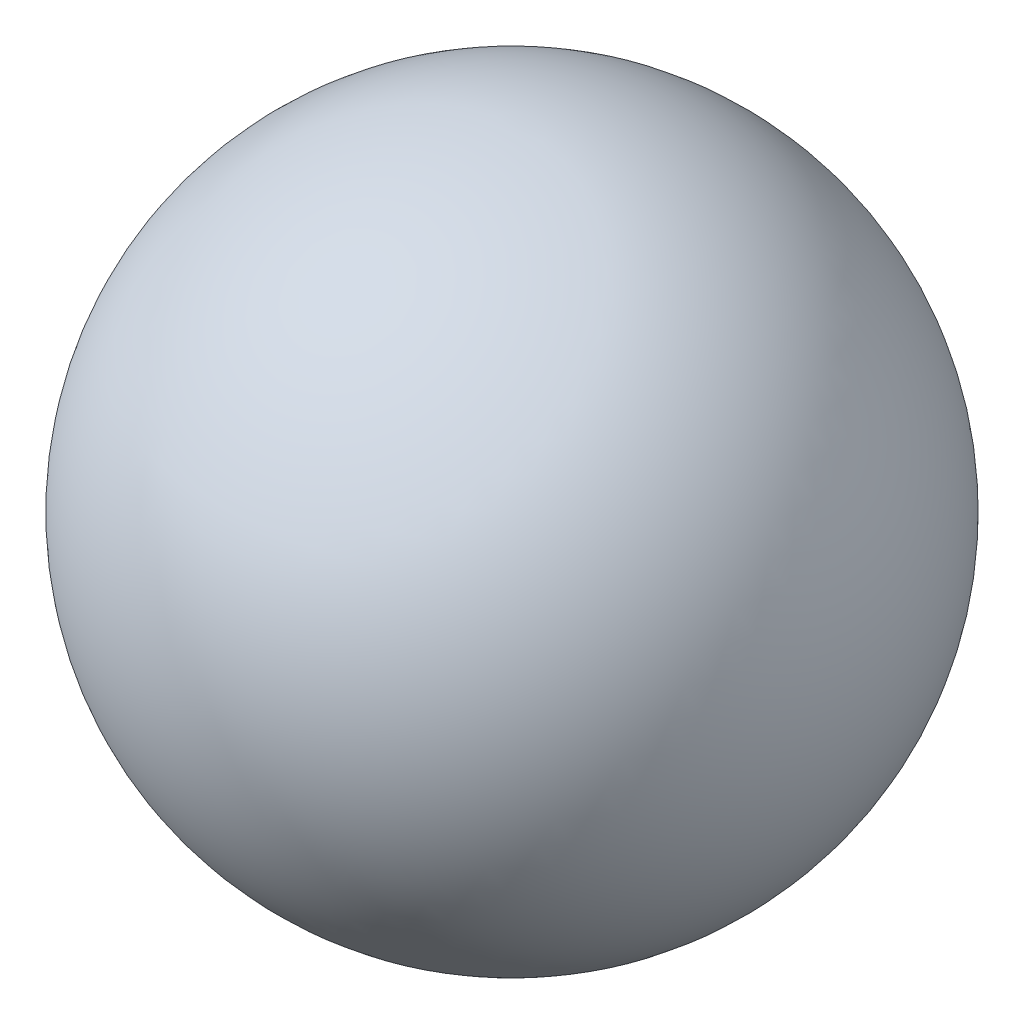
ISO-10303-21;
HEADER;
FILE_DESCRIPTION(('STEP AP214'),'2;1');
FILE_NAME('part.step','',(''),(''),'','','');
FILE_SCHEMA(('AUTOMOTIVE_DESIGN { 1 0 10303 214 1 1 1 1 }'));
ENDSEC;
DATA;
#1=APPLICATION_CONTEXT('core data for automotive mechanical design processes');
#2=APPLICATION_PROTOCOL_DEFINITION('international standard','automotive_design',2000,#1);
#3=PRODUCT_CONTEXT('',#1,'mechanical');
#4=PRODUCT('Part','Part','',(#3));
#5=PRODUCT_RELATED_PRODUCT_CATEGORY('part','',(#4));
#6=PRODUCT_DEFINITION_FORMATION('','',#4);
#7=PRODUCT_DEFINITION_CONTEXT('part definition',#1,'design');
#8=PRODUCT_DEFINITION('design','',#6,#7);
#9=PRODUCT_DEFINITION_SHAPE('','',#8);
#10=(LENGTH_UNIT() NAMED_UNIT(*) SI_UNIT(.MILLI.,.METRE.));
#11=(NAMED_UNIT(*) PLANE_ANGLE_UNIT() SI_UNIT($,.RADIAN.));
#12=(NAMED_UNIT(*) SI_UNIT($,.STERADIAN.) SOLID_ANGLE_UNIT());
#13=UNCERTAINTY_MEASURE_WITH_UNIT(LENGTH_MEASURE(1.E-05),#10,'distance_accuracy_value','');
#14=(GEOMETRIC_REPRESENTATION_CONTEXT(3) GLOBAL_UNCERTAINTY_ASSIGNED_CONTEXT((#13)) GLOBAL_UNIT_ASSIGNED_CONTEXT((#10,
#11,#12)) REPRESENTATION_CONTEXT('',''));
#15=CARTESIAN_POINT('',(0.,0.,0.));
#16=DIRECTION('',(0.,0.,1.));
#17=DIRECTION('',(1.,0.,0.));
#18=AXIS2_PLACEMENT_3D('',#15,#16,#17);
#19=CARTESIAN_POINT('',(0.,0.,0.));
#20=DIRECTION('',(0.,-1.,0.));
#21=DIRECTION('',(-1.,0.,0.));
#22=AXIS2_PLACEMENT_3D('',#19,#20,#21);
#23=SPHERICAL_SURFACE('',#22,7.);
#24=CARTESIAN_POINT('',(0.,-7.,0.));
#25=VERTEX_POINT('',#24);
#26=VERTEX_LOOP('',#25);
#27=FACE_BOUND('',#26,.T.);
#28=ADVANCED_FACE('F31',(#27),#23,.T.);
#29=CLOSED_SHELL('',(#28));
#30=MANIFOLD_SOLID_BREP('B2',#29);
#31=ADVANCED_BREP_SHAPE_REPRESENTATION('',(#18,#30),#14);
#32=SHAPE_DEFINITION_REPRESENTATION(#9,#31);
ENDSEC;
END-ISO-10303-21;
